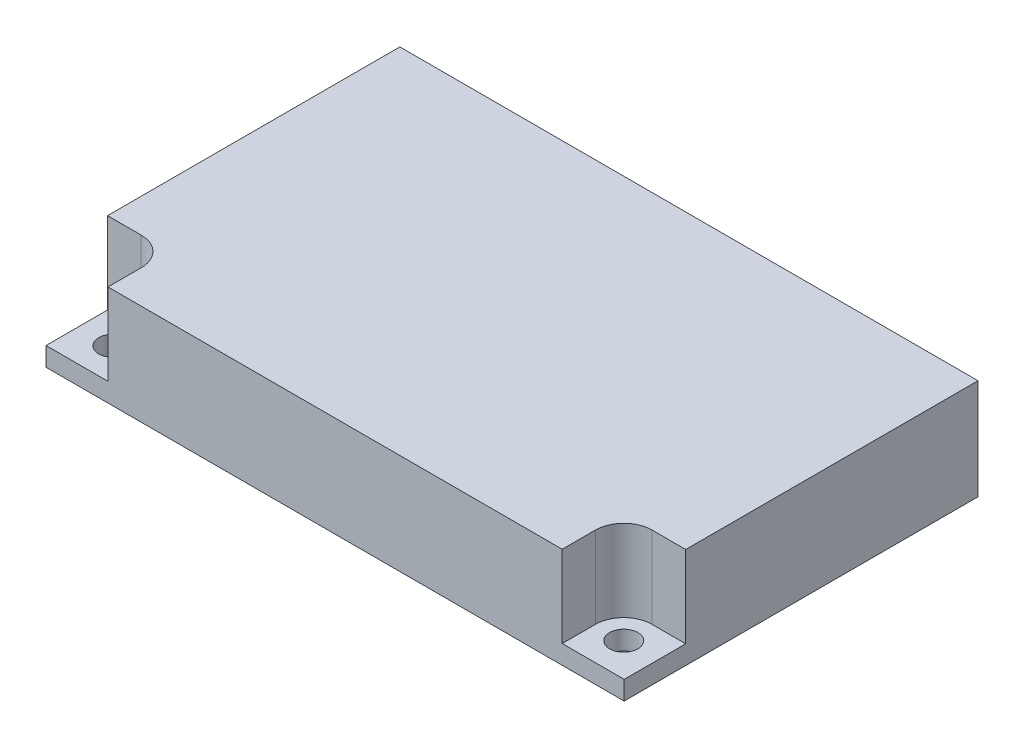
ISO-10303-21;
HEADER;
FILE_DESCRIPTION(('STEP AP214'),'2;1');
FILE_NAME('part.step','',(''),(''),'','','');
FILE_SCHEMA(('AUTOMOTIVE_DESIGN { 1 0 10303 214 1 1 1 1 }'));
ENDSEC;
DATA;
#1=APPLICATION_CONTEXT('core data for automotive mechanical design processes');
#2=APPLICATION_PROTOCOL_DEFINITION('international standard','automotive_design',2000,#1);
#3=PRODUCT_CONTEXT('',#1,'mechanical');
#4=PRODUCT('Part','Part','',(#3));
#5=PRODUCT_RELATED_PRODUCT_CATEGORY('part','',(#4));
#6=PRODUCT_DEFINITION_FORMATION('','',#4);
#7=PRODUCT_DEFINITION_CONTEXT('part definition',#1,'design');
#8=PRODUCT_DEFINITION('design','',#6,#7);
#9=PRODUCT_DEFINITION_SHAPE('','',#8);
#10=(LENGTH_UNIT() NAMED_UNIT(*) SI_UNIT(.MILLI.,.METRE.));
#11=(NAMED_UNIT(*) PLANE_ANGLE_UNIT() SI_UNIT($,.RADIAN.));
#12=(NAMED_UNIT(*) SI_UNIT($,.STERADIAN.) SOLID_ANGLE_UNIT());
#13=UNCERTAINTY_MEASURE_WITH_UNIT(LENGTH_MEASURE(1.E-05),#10,'distance_accuracy_value','');
#14=(GEOMETRIC_REPRESENTATION_CONTEXT(3) GLOBAL_UNCERTAINTY_ASSIGNED_CONTEXT((#13)) GLOBAL_UNIT_ASSIGNED_CONTEXT((#10,
#11,#12)) REPRESENTATION_CONTEXT('',''));
#15=CARTESIAN_POINT('',(0.,0.,0.));
#16=DIRECTION('',(0.,0.,1.));
#17=DIRECTION('',(1.,0.,0.));
#18=AXIS2_PLACEMENT_3D('',#15,#16,#17);
#19=CARTESIAN_POINT('',(0.,1.5,0.));
#20=DIRECTION('',(0.,-1.,0.));
#21=DIRECTION('',(0.,0.,-1.));
#22=AXIS2_PLACEMENT_3D('',#19,#20,#21);
#23=PLANE('',#22);
#24=CARTESIAN_POINT('',(20.32,1.5,11.43));
#25=DIRECTION('',(0.,1.,0.));
#26=DIRECTION('',(0.,0.,1.));
#27=AXIS2_PLACEMENT_3D('',#24,#25,#26);
#28=CIRCLE('',#27,1.125);
#29=CARTESIAN_POINT('',(20.32,1.5,12.555));
#30=VERTEX_POINT('',#29);
#31=EDGE_CURVE('E195',#30,#30,#28,.T.);
#32=ORIENTED_EDGE('',*,*,#31,.F.);
#33=EDGE_LOOP('',(#32));
#34=FACE_BOUND('',#33,.T.);
#35=DIRECTION('',(1.,0.,0.));
#36=VECTOR('',#35,1.);
#37=CARTESIAN_POINT('',(20.32,1.5,9.18));
#38=LINE('',#37,#36);
#39=CARTESIAN_POINT('',(20.32,1.5,9.18));
#40=VERTEX_POINT('',#39);
#41=CARTESIAN_POINT('',(23.,1.5,9.18));
#42=VERTEX_POINT('',#41);
#43=EDGE_CURVE('E54',#40,#42,#38,.T.);
#44=ORIENTED_EDGE('',*,*,#43,.F.);
#45=CARTESIAN_POINT('',(20.32,1.5,11.43));
#46=DIRECTION('',(0.,-1.,0.));
#47=DIRECTION('',(0.,0.,1.));
#48=AXIS2_PLACEMENT_3D('',#45,#46,#47);
#49=CIRCLE('',#48,2.25);
#50=CARTESIAN_POINT('',(18.07,1.5,11.43));
#51=VERTEX_POINT('',#50);
#52=EDGE_CURVE('E59',#51,#40,#49,.T.);
#53=ORIENTED_EDGE('',*,*,#52,.F.);
#54=DIRECTION('',(0.,0.,-1.));
#55=VECTOR('',#54,1.);
#56=CARTESIAN_POINT('',(18.07,1.5,14.075));
#57=LINE('',#56,#55);
#58=CARTESIAN_POINT('',(18.07,1.5,14.075));
#59=VERTEX_POINT('',#58);
#60=EDGE_CURVE('E154',#59,#51,#57,.T.);
#61=ORIENTED_EDGE('',*,*,#60,.F.);
#62=DIRECTION('',(1.,0.,0.));
#63=VECTOR('',#62,1.);
#64=CARTESIAN_POINT('',(-23.,1.5,14.075));
#65=LINE('',#64,#63);
#66=CARTESIAN_POINT('',(23.,1.5,14.075));
#67=VERTEX_POINT('',#66);
#68=EDGE_CURVE('E138',#59,#67,#65,.T.);
#69=ORIENTED_EDGE('',*,*,#68,.T.);
#70=DIRECTION('',(0.,0.,-1.));
#71=VECTOR('',#70,1.);
#72=CARTESIAN_POINT('',(23.,1.5,14.075));
#73=LINE('',#72,#71);
#74=EDGE_CURVE('E201',#67,#42,#73,.T.);
#75=ORIENTED_EDGE('',*,*,#74,.T.);
#76=EDGE_LOOP('',(#44,#53,#61,#69,#75));
#77=FACE_BOUND('',#76,.T.);
#78=ADVANCED_FACE('F39',(#34,#77),#23,.F.);
#79=CARTESIAN_POINT('',(-20.32,1.5,11.43));
#80=DIRECTION('',(0.,1.,0.));
#81=DIRECTION('',(0.,0.,-1.));
#82=AXIS2_PLACEMENT_3D('',#79,#80,#81);
#83=CIRCLE('',#82,1.125);
#84=CARTESIAN_POINT('',(-20.32,1.5,10.305));
#85=VERTEX_POINT('',#84);
#86=EDGE_CURVE('E187',#85,#85,#83,.T.);
#87=ORIENTED_EDGE('',*,*,#86,.F.);
#88=EDGE_LOOP('',(#87));
#89=FACE_BOUND('',#88,.T.);
#90=DIRECTION('',(1.,0.,0.));
#91=VECTOR('',#90,1.);
#92=CARTESIAN_POINT('',(-23.,1.5,9.18));
#93=LINE('',#92,#91);
#94=CARTESIAN_POINT('',(-23.,1.5,9.18));
#95=VERTEX_POINT('',#94);
#96=CARTESIAN_POINT('',(-20.32,1.5,9.17999999999999));
#97=VERTEX_POINT('',#96);
#98=EDGE_CURVE('E164',#95,#97,#93,.T.);
#99=ORIENTED_EDGE('',*,*,#98,.F.);
#100=DIRECTION('',(0.,0.,1.));
#101=VECTOR('',#100,1.);
#102=CARTESIAN_POINT('',(-23.,1.5,14.075));
#103=LINE('',#102,#101);
#104=CARTESIAN_POINT('',(-23.,1.5,14.075));
#105=VERTEX_POINT('',#104);
#106=EDGE_CURVE('E133',#95,#105,#103,.T.);
#107=ORIENTED_EDGE('',*,*,#106,.T.);
#108=CARTESIAN_POINT('',(-18.07,1.5,14.075));
#109=VERTEX_POINT('',#108);
#110=EDGE_CURVE('E126',#105,#109,#65,.T.);
#111=ORIENTED_EDGE('',*,*,#110,.T.);
#112=DIRECTION('',(0.,0.,1.));
#113=VECTOR('',#112,1.);
#114=CARTESIAN_POINT('',(-18.07,1.5,11.43));
#115=LINE('',#114,#113);
#116=CARTESIAN_POINT('',(-18.07,1.5,11.43));
#117=VERTEX_POINT('',#116);
#118=EDGE_CURVE('E130',#117,#109,#115,.T.);
#119=ORIENTED_EDGE('',*,*,#118,.F.);
#120=CARTESIAN_POINT('',(-20.32,1.5,11.43));
#121=DIRECTION('',(0.,-1.,0.));
#122=DIRECTION('',(0.,0.,1.));
#123=AXIS2_PLACEMENT_3D('',#120,#121,#122);
#124=CIRCLE('',#123,2.25);
#125=EDGE_CURVE('E155',#97,#117,#124,.T.);
#126=ORIENTED_EDGE('',*,*,#125,.F.);
#127=EDGE_LOOP('',(#99,#107,#111,#119,#126));
#128=FACE_BOUND('',#127,.T.);
#129=ADVANCED_FACE('F128',(#89,#128),#23,.F.);
#130=CARTESIAN_POINT('',(0.,0.,0.));
#131=DIRECTION('',(0.,-1.,0.));
#132=DIRECTION('',(0.,0.,-1.));
#133=AXIS2_PLACEMENT_3D('',#130,#131,#132);
#134=PLANE('',#133);
#135=CARTESIAN_POINT('',(20.32,0.,11.43));
#136=DIRECTION('',(0.,1.,0.));
#137=DIRECTION('',(0.,0.,1.));
#138=AXIS2_PLACEMENT_3D('',#135,#136,#137);
#139=CIRCLE('',#138,1.125);
#140=CARTESIAN_POINT('',(20.32,0.,12.555));
#141=VERTEX_POINT('',#140);
#142=EDGE_CURVE('E190',#141,#141,#139,.T.);
#143=ORIENTED_EDGE('',*,*,#142,.T.);
#144=EDGE_LOOP('',(#143));
#145=FACE_BOUND('',#144,.T.);
#146=DIRECTION('',(0.,0.,-1.));
#147=VECTOR('',#146,1.);
#148=CARTESIAN_POINT('',(23.,0.,14.075));
#149=LINE('',#148,#147);
#150=CARTESIAN_POINT('',(23.,0.,14.075));
#151=VERTEX_POINT('',#150);
#152=CARTESIAN_POINT('',(23.,0.,-14.075));
#153=VERTEX_POINT('',#152);
#154=EDGE_CURVE('E198',#151,#153,#149,.T.);
#155=ORIENTED_EDGE('',*,*,#154,.F.);
#156=DIRECTION('',(1.,0.,0.));
#157=VECTOR('',#156,1.);
#158=CARTESIAN_POINT('',(-23.,0.,14.075));
#159=LINE('',#158,#157);
#160=CARTESIAN_POINT('',(-23.,0.,14.075));
#161=VERTEX_POINT('',#160);
#162=EDGE_CURVE('E203',#161,#151,#159,.T.);
#163=ORIENTED_EDGE('',*,*,#162,.F.);
#164=DIRECTION('',(0.,0.,1.));
#165=VECTOR('',#164,1.);
#166=CARTESIAN_POINT('',(-23.,0.,14.075));
#167=LINE('',#166,#165);
#168=CARTESIAN_POINT('',(-23.,0.,-14.075));
#169=VERTEX_POINT('',#168);
#170=EDGE_CURVE('E209',#169,#161,#167,.T.);
#171=ORIENTED_EDGE('',*,*,#170,.F.);
#172=DIRECTION('',(-1.,0.,0.));
#173=VECTOR('',#172,1.);
#174=CARTESIAN_POINT('',(-23.,0.,-14.075));
#175=LINE('',#174,#173);
#176=EDGE_CURVE('E207',#153,#169,#175,.T.);
#177=ORIENTED_EDGE('',*,*,#176,.F.);
#178=EDGE_LOOP('',(#155,#163,#171,#177));
#179=FACE_BOUND('',#178,.T.);
#180=CARTESIAN_POINT('',(-20.32,0.,11.43));
#181=DIRECTION('',(0.,1.,0.));
#182=DIRECTION('',(0.,0.,-1.));
#183=AXIS2_PLACEMENT_3D('',#180,#181,#182);
#184=CIRCLE('',#183,1.125);
#185=CARTESIAN_POINT('',(-20.32,0.,10.305));
#186=VERTEX_POINT('',#185);
#187=EDGE_CURVE('E191',#186,#186,#184,.T.);
#188=ORIENTED_EDGE('',*,*,#187,.T.);
#189=EDGE_LOOP('',(#188));
#190=FACE_BOUND('',#189,.T.);
#191=ADVANCED_FACE('F227',(#145,#179,#190),#134,.T.);
#192=CARTESIAN_POINT('',(23.,1.5,14.075));
#193=DIRECTION('',(-1.,0.,0.));
#194=DIRECTION('',(0.,0.,1.));
#195=AXIS2_PLACEMENT_3D('',#192,#193,#194);
#196=PLANE('',#195);
#197=ORIENTED_EDGE('',*,*,#154,.T.);
#198=DIRECTION('',(0.,-1.,0.));
#199=VECTOR('',#198,1.);
#200=CARTESIAN_POINT('',(23.,1.5,-14.075));
#201=LINE('',#200,#199);
#202=CARTESIAN_POINT('',(23.,8.,-14.075));
#203=VERTEX_POINT('',#202);
#204=EDGE_CURVE('E12',#203,#153,#201,.T.);
#205=ORIENTED_EDGE('',*,*,#204,.F.);
#206=DIRECTION('',(0.,0.,1.));
#207=VECTOR('',#206,1.);
#208=CARTESIAN_POINT('',(23.,8.,9.18));
#209=LINE('',#208,#207);
#210=CARTESIAN_POINT('',(23.,8.,9.18));
#211=VERTEX_POINT('',#210);
#212=EDGE_CURVE('E260',#203,#211,#209,.T.);
#213=ORIENTED_EDGE('',*,*,#212,.T.);
#214=DIRECTION('',(0.,-1.,0.));
#215=VECTOR('',#214,1.);
#216=CARTESIAN_POINT('',(23.,69.9297923229823,9.18));
#217=LINE('',#216,#215);
#218=EDGE_CURVE('E173',#211,#42,#217,.T.);
#219=ORIENTED_EDGE('',*,*,#218,.T.);
#220=ORIENTED_EDGE('',*,*,#74,.F.);
#221=DIRECTION('',(0.,-1.,0.));
#222=VECTOR('',#221,1.);
#223=CARTESIAN_POINT('',(23.,1.5,14.075));
#224=LINE('',#223,#222);
#225=EDGE_CURVE('E137',#67,#151,#224,.T.);
#226=ORIENTED_EDGE('',*,*,#225,.T.);
#227=EDGE_LOOP('',(#197,#205,#213,#219,#220,#226));
#228=FACE_BOUND('',#227,.T.);
#229=ADVANCED_FACE('F41',(#228),#196,.F.);
#230=CARTESIAN_POINT('',(-23.,1.5,-14.075));
#231=DIRECTION('',(0.,0.,1.));
#232=DIRECTION('',(1.,0.,0.));
#233=AXIS2_PLACEMENT_3D('',#230,#231,#232);
#234=PLANE('',#233);
#235=ORIENTED_EDGE('',*,*,#176,.T.);
#236=DIRECTION('',(0.,-1.,0.));
#237=VECTOR('',#236,1.);
#238=CARTESIAN_POINT('',(-23.,1.5,-14.075));
#239=LINE('',#238,#237);
#240=CARTESIAN_POINT('',(-23.,8.,-14.075));
#241=VERTEX_POINT('',#240);
#242=EDGE_CURVE('E47',#241,#169,#239,.T.);
#243=ORIENTED_EDGE('',*,*,#242,.F.);
#244=DIRECTION('',(1.,0.,0.));
#245=VECTOR('',#244,1.);
#246=CARTESIAN_POINT('',(23.,8.,-14.075));
#247=LINE('',#246,#245);
#248=EDGE_CURVE('E258',#241,#203,#247,.T.);
#249=ORIENTED_EDGE('',*,*,#248,.T.);
#250=ORIENTED_EDGE('',*,*,#204,.T.);
#251=EDGE_LOOP('',(#235,#243,#249,#250));
#252=FACE_BOUND('',#251,.T.);
#253=ADVANCED_FACE('F295',(#252),#234,.F.);
#254=CARTESIAN_POINT('',(-23.,1.5,14.075));
#255=DIRECTION('',(1.,0.,0.));
#256=DIRECTION('',(0.,0.,-1.));
#257=AXIS2_PLACEMENT_3D('',#254,#255,#256);
#258=PLANE('',#257);
#259=ORIENTED_EDGE('',*,*,#170,.T.);
#260=DIRECTION('',(0.,-1.,0.));
#261=VECTOR('',#260,1.);
#262=CARTESIAN_POINT('',(-23.,1.5,14.075));
#263=LINE('',#262,#261);
#264=EDGE_CURVE('E214',#105,#161,#263,.T.);
#265=ORIENTED_EDGE('',*,*,#264,.F.);
#266=ORIENTED_EDGE('',*,*,#106,.F.);
#267=DIRECTION('',(0.,-1.,0.));
#268=VECTOR('',#267,1.);
#269=CARTESIAN_POINT('',(-23.,69.9297923229823,9.18));
#270=LINE('',#269,#268);
#271=CARTESIAN_POINT('',(-23.,8.,9.18));
#272=VERTEX_POINT('',#271);
#273=EDGE_CURVE('E170',#272,#95,#270,.T.);
#274=ORIENTED_EDGE('',*,*,#273,.F.);
#275=DIRECTION('',(0.,0.,-1.));
#276=VECTOR('',#275,1.);
#277=CARTESIAN_POINT('',(-23.,8.,-14.075));
#278=LINE('',#277,#276);
#279=EDGE_CURVE('E186',#272,#241,#278,.T.);
#280=ORIENTED_EDGE('',*,*,#279,.T.);
#281=ORIENTED_EDGE('',*,*,#242,.T.);
#282=EDGE_LOOP('',(#259,#265,#266,#274,#280,#281));
#283=FACE_BOUND('',#282,.T.);
#284=ADVANCED_FACE('F219',(#283),#258,.F.);
#285=CARTESIAN_POINT('',(-23.,1.5,14.075));
#286=DIRECTION('',(0.,0.,-1.));
#287=DIRECTION('',(-1.,0.,0.));
#288=AXIS2_PLACEMENT_3D('',#285,#286,#287);
#289=PLANE('',#288);
#290=ORIENTED_EDGE('',*,*,#162,.T.);
#291=ORIENTED_EDGE('',*,*,#225,.F.);
#292=ORIENTED_EDGE('',*,*,#68,.F.);
#293=DIRECTION('',(0.,-1.,0.));
#294=VECTOR('',#293,1.);
#295=CARTESIAN_POINT('',(18.07,69.9297923229823,14.075));
#296=LINE('',#295,#294);
#297=CARTESIAN_POINT('',(18.07,8.,14.075));
#298=VERTEX_POINT('',#297);
#299=EDGE_CURVE('E149',#298,#59,#296,.T.);
#300=ORIENTED_EDGE('',*,*,#299,.F.);
#301=DIRECTION('',(-1.,0.,0.));
#302=VECTOR('',#301,1.);
#303=CARTESIAN_POINT('',(-18.07,8.,14.075));
#304=LINE('',#303,#302);
#305=CARTESIAN_POINT('',(-18.07,8.,14.075));
#306=VERTEX_POINT('',#305);
#307=EDGE_CURVE('E145',#298,#306,#304,.T.);
#308=ORIENTED_EDGE('',*,*,#307,.T.);
#309=DIRECTION('',(0.,-1.,0.));
#310=VECTOR('',#309,1.);
#311=CARTESIAN_POINT('',(-18.07,69.9297923229823,14.075));
#312=LINE('',#311,#310);
#313=EDGE_CURVE('E142',#306,#109,#312,.T.);
#314=ORIENTED_EDGE('',*,*,#313,.T.);
#315=ORIENTED_EDGE('',*,*,#110,.F.);
#316=ORIENTED_EDGE('',*,*,#264,.T.);
#317=EDGE_LOOP('',(#290,#291,#292,#300,#308,#314,#315,#316));
#318=FACE_BOUND('',#317,.T.);
#319=ADVANCED_FACE('F143',(#318),#289,.F.);
#320=CARTESIAN_POINT('',(20.32,1.5,11.43));
#321=DIRECTION('',(0.,-1.,0.));
#322=DIRECTION('',(0.,0.,-1.));
#323=AXIS2_PLACEMENT_3D('',#320,#321,#322);
#324=CYLINDRICAL_SURFACE('',#323,1.125);
#325=ORIENTED_EDGE('',*,*,#31,.T.);
#326=EDGE_LOOP('',(#325));
#327=FACE_BOUND('',#326,.T.);
#328=ORIENTED_EDGE('',*,*,#142,.F.);
#329=EDGE_LOOP('',(#328));
#330=FACE_BOUND('',#329,.T.);
#331=ADVANCED_FACE('F287',(#327,#330),#324,.F.);
#332=CARTESIAN_POINT('',(-20.32,1.5,11.43));
#333=DIRECTION('',(0.,-1.,0.));
#334=DIRECTION('',(0.,0.,-1.));
#335=AXIS2_PLACEMENT_3D('',#332,#333,#334);
#336=CYLINDRICAL_SURFACE('',#335,1.125);
#337=ORIENTED_EDGE('',*,*,#86,.T.);
#338=EDGE_LOOP('',(#337));
#339=FACE_BOUND('',#338,.T.);
#340=ORIENTED_EDGE('',*,*,#187,.F.);
#341=EDGE_LOOP('',(#340));
#342=FACE_BOUND('',#341,.T.);
#343=ADVANCED_FACE('F321',(#339,#342),#336,.F.);
#344=CARTESIAN_POINT('',(-23.,69.9297923229823,9.18));
#345=DIRECTION('',(0.,0.,-1.));
#346=DIRECTION('',(-1.,0.,0.));
#347=AXIS2_PLACEMENT_3D('',#344,#345,#346);
#348=PLANE('',#347);
#349=DIRECTION('',(0.,-1.,0.));
#350=VECTOR('',#349,1.);
#351=CARTESIAN_POINT('',(-20.32,69.9297923229823,9.17999999999999));
#352=LINE('',#351,#350);
#353=CARTESIAN_POINT('',(-20.32,8.,9.17999999999999));
#354=VERTEX_POINT('',#353);
#355=EDGE_CURVE('E167',#354,#97,#352,.T.);
#356=ORIENTED_EDGE('',*,*,#355,.F.);
#357=DIRECTION('',(-1.,0.,0.));
#358=VECTOR('',#357,1.);
#359=CARTESIAN_POINT('',(-23.,8.,9.18));
#360=LINE('',#359,#358);
#361=EDGE_CURVE('E183',#354,#272,#360,.T.);
#362=ORIENTED_EDGE('',*,*,#361,.T.);
#363=ORIENTED_EDGE('',*,*,#273,.T.);
#364=ORIENTED_EDGE('',*,*,#98,.T.);
#365=EDGE_LOOP('',(#356,#362,#363,#364));
#366=FACE_BOUND('',#365,.T.);
#367=ADVANCED_FACE('F255',(#366),#348,.F.);
#368=CARTESIAN_POINT('',(20.32,69.9297923229823,9.18));
#369=DIRECTION('',(0.,0.,-1.));
#370=DIRECTION('',(-1.,0.,0.));
#371=AXIS2_PLACEMENT_3D('',#368,#369,#370);
#372=PLANE('',#371);
#373=ORIENTED_EDGE('',*,*,#218,.F.);
#374=DIRECTION('',(-1.,0.,0.));
#375=VECTOR('',#374,1.);
#376=CARTESIAN_POINT('',(20.32,8.,9.18));
#377=LINE('',#376,#375);
#378=CARTESIAN_POINT('',(20.32,8.,9.18));
#379=VERTEX_POINT('',#378);
#380=EDGE_CURVE('E246',#211,#379,#377,.T.);
#381=ORIENTED_EDGE('',*,*,#380,.T.);
#382=DIRECTION('',(0.,-1.,0.));
#383=VECTOR('',#382,1.);
#384=CARTESIAN_POINT('',(20.32,69.9297923229823,9.18));
#385=LINE('',#384,#383);
#386=EDGE_CURVE('E176',#379,#40,#385,.T.);
#387=ORIENTED_EDGE('',*,*,#386,.T.);
#388=ORIENTED_EDGE('',*,*,#43,.T.);
#389=EDGE_LOOP('',(#373,#381,#387,#388));
#390=FACE_BOUND('',#389,.T.);
#391=ADVANCED_FACE('F265',(#390),#372,.F.);
#392=CARTESIAN_POINT('',(20.32,69.9297923229823,11.43));
#393=DIRECTION('',(0.,-1.,0.));
#394=DIRECTION('',(0.,0.,-1.));
#395=AXIS2_PLACEMENT_3D('',#392,#393,#394);
#396=CYLINDRICAL_SURFACE('',#395,2.25);
#397=ORIENTED_EDGE('',*,*,#386,.F.);
#398=CARTESIAN_POINT('',(20.32,8.,11.43));
#399=DIRECTION('',(0.,-1.,0.));
#400=DIRECTION('',(0.,0.,-1.));
#401=AXIS2_PLACEMENT_3D('',#398,#399,#400);
#402=CIRCLE('',#401,2.25);
#403=CARTESIAN_POINT('',(18.07,8.,11.43));
#404=VERTEX_POINT('',#403);
#405=EDGE_CURVE('E242',#379,#404,#402,.F.);
#406=ORIENTED_EDGE('',*,*,#405,.T.);
#407=DIRECTION('',(0.,-1.,0.));
#408=VECTOR('',#407,1.);
#409=CARTESIAN_POINT('',(18.07,69.9297923229823,11.43));
#410=LINE('',#409,#408);
#411=EDGE_CURVE('E178',#404,#51,#410,.T.);
#412=ORIENTED_EDGE('',*,*,#411,.T.);
#413=ORIENTED_EDGE('',*,*,#52,.T.);
#414=EDGE_LOOP('',(#397,#406,#412,#413));
#415=FACE_BOUND('',#414,.T.);
#416=ADVANCED_FACE('F268',(#415),#396,.F.);
#417=CARTESIAN_POINT('',(18.07,69.9297923229823,14.075));
#418=DIRECTION('',(-1.,0.,0.));
#419=DIRECTION('',(0.,0.,1.));
#420=AXIS2_PLACEMENT_3D('',#417,#418,#419);
#421=PLANE('',#420);
#422=ORIENTED_EDGE('',*,*,#411,.F.);
#423=DIRECTION('',(0.,0.,1.));
#424=VECTOR('',#423,1.);
#425=CARTESIAN_POINT('',(18.07,8.,14.075));
#426=LINE('',#425,#424);
#427=EDGE_CURVE('E239',#404,#298,#426,.T.);
#428=ORIENTED_EDGE('',*,*,#427,.T.);
#429=ORIENTED_EDGE('',*,*,#299,.T.);
#430=ORIENTED_EDGE('',*,*,#60,.T.);
#431=EDGE_LOOP('',(#422,#428,#429,#430));
#432=FACE_BOUND('',#431,.T.);
#433=ADVANCED_FACE('F238',(#432),#421,.F.);
#434=CARTESIAN_POINT('',(-18.07,69.9297923229823,11.43));
#435=DIRECTION('',(1.,0.,0.));
#436=DIRECTION('',(0.,0.,-1.));
#437=AXIS2_PLACEMENT_3D('',#434,#435,#436);
#438=PLANE('',#437);
#439=ORIENTED_EDGE('',*,*,#313,.F.);
#440=DIRECTION('',(0.,0.,-1.));
#441=VECTOR('',#440,1.);
#442=CARTESIAN_POINT('',(-18.07,8.,11.43));
#443=LINE('',#442,#441);
#444=CARTESIAN_POINT('',(-18.07,8.,11.43));
#445=VERTEX_POINT('',#444);
#446=EDGE_CURVE('E244',#306,#445,#443,.T.);
#447=ORIENTED_EDGE('',*,*,#446,.T.);
#448=DIRECTION('',(0.,-1.,0.));
#449=VECTOR('',#448,1.);
#450=CARTESIAN_POINT('',(-18.07,69.9297923229823,11.43));
#451=LINE('',#450,#449);
#452=EDGE_CURVE('E148',#445,#117,#451,.T.);
#453=ORIENTED_EDGE('',*,*,#452,.T.);
#454=ORIENTED_EDGE('',*,*,#118,.T.);
#455=EDGE_LOOP('',(#439,#447,#453,#454));
#456=FACE_BOUND('',#455,.T.);
#457=ADVANCED_FACE('F151',(#456),#438,.F.);
#458=CARTESIAN_POINT('',(-20.32,69.9297923229823,11.43));
#459=DIRECTION('',(0.,-1.,0.));
#460=DIRECTION('',(0.,0.,-1.));
#461=AXIS2_PLACEMENT_3D('',#458,#459,#460);
#462=CYLINDRICAL_SURFACE('',#461,2.25);
#463=ORIENTED_EDGE('',*,*,#452,.F.);
#464=CARTESIAN_POINT('',(-20.32,8.,11.43));
#465=DIRECTION('',(0.,-1.,0.));
#466=DIRECTION('',(0.,0.,-1.));
#467=AXIS2_PLACEMENT_3D('',#464,#465,#466);
#468=CIRCLE('',#467,2.25);
#469=EDGE_CURVE('E194',#445,#354,#468,.F.);
#470=ORIENTED_EDGE('',*,*,#469,.T.);
#471=ORIENTED_EDGE('',*,*,#355,.T.);
#472=ORIENTED_EDGE('',*,*,#125,.T.);
#473=EDGE_LOOP('',(#463,#470,#471,#472));
#474=FACE_BOUND('',#473,.T.);
#475=ADVANCED_FACE('F253',(#474),#462,.F.);
#476=CARTESIAN_POINT('',(0.,8.,0.));
#477=DIRECTION('',(0.,-1.,0.));
#478=DIRECTION('',(0.,0.,-1.));
#479=AXIS2_PLACEMENT_3D('',#476,#477,#478);
#480=PLANE('',#479);
#481=ORIENTED_EDGE('',*,*,#446,.F.);
#482=ORIENTED_EDGE('',*,*,#307,.F.);
#483=ORIENTED_EDGE('',*,*,#427,.F.);
#484=ORIENTED_EDGE('',*,*,#405,.F.);
#485=ORIENTED_EDGE('',*,*,#380,.F.);
#486=ORIENTED_EDGE('',*,*,#212,.F.);
#487=ORIENTED_EDGE('',*,*,#248,.F.);
#488=ORIENTED_EDGE('',*,*,#279,.F.);
#489=ORIENTED_EDGE('',*,*,#361,.F.);
#490=ORIENTED_EDGE('',*,*,#469,.F.);
#491=EDGE_LOOP('',(#481,#482,#483,#484,#485,#486,#487,#488,#489,#490));
#492=FACE_BOUND('',#491,.T.);
#493=ADVANCED_FACE('F256',(#492),#480,.F.);
#494=CLOSED_SHELL('',(#78,#129,#191,#229,#253,#284,#319,#331,#343,#367,#391,#416,#433,#457,#475,#493));
#495=MANIFOLD_SOLID_BREP('B2',#494);
#496=ADVANCED_BREP_SHAPE_REPRESENTATION('',(#18,#495),#14);
#497=SHAPE_DEFINITION_REPRESENTATION(#9,#496);
ENDSEC;
END-ISO-10303-21;
